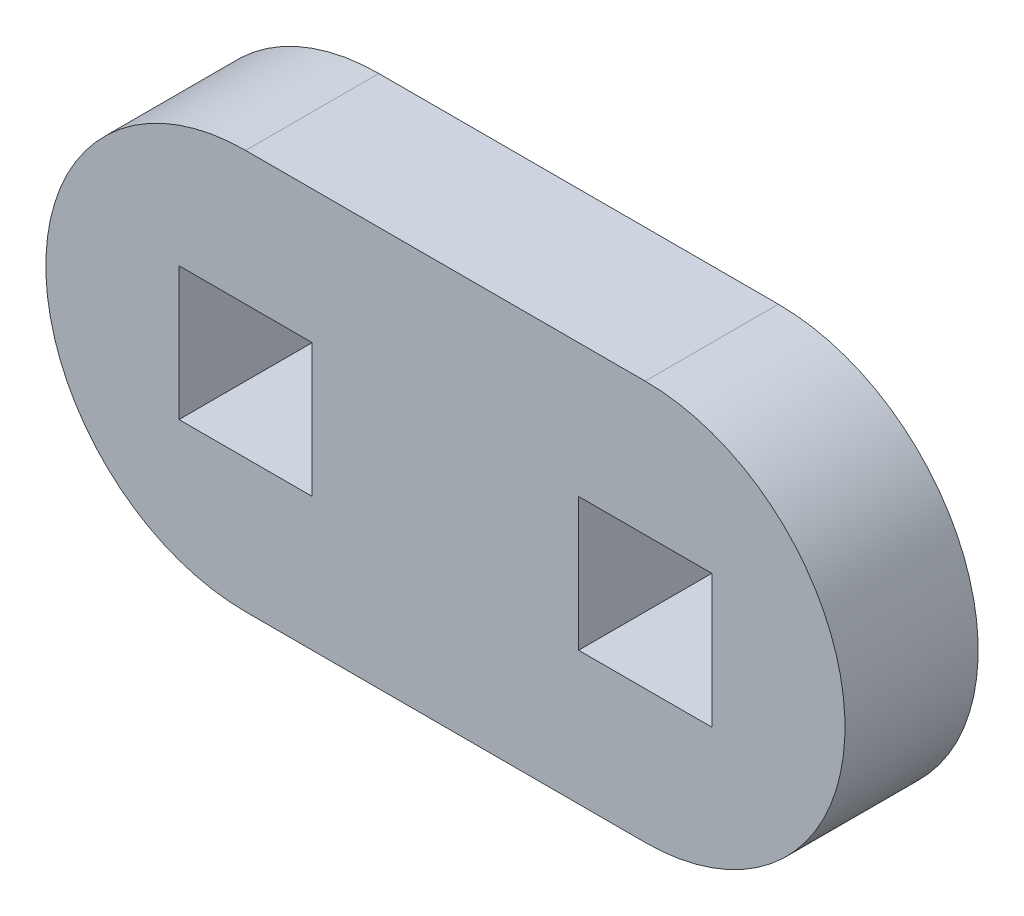
ISO-10303-21;
HEADER;
FILE_DESCRIPTION(('STEP AP214'),'2;1');
FILE_NAME('part.step','',(''),(''),'','','');
FILE_SCHEMA(('AUTOMOTIVE_DESIGN { 1 0 10303 214 1 1 1 1 }'));
ENDSEC;
DATA;
#1=APPLICATION_CONTEXT('core data for automotive mechanical design processes');
#2=APPLICATION_PROTOCOL_DEFINITION('international standard','automotive_design',2000,#1);
#3=PRODUCT_CONTEXT('',#1,'mechanical');
#4=PRODUCT('Part','Part','',(#3));
#5=PRODUCT_RELATED_PRODUCT_CATEGORY('part','',(#4));
#6=PRODUCT_DEFINITION_FORMATION('','',#4);
#7=PRODUCT_DEFINITION_CONTEXT('part definition',#1,'design');
#8=PRODUCT_DEFINITION('design','',#6,#7);
#9=PRODUCT_DEFINITION_SHAPE('','',#8);
#10=(LENGTH_UNIT() NAMED_UNIT(*) SI_UNIT(.MILLI.,.METRE.));
#11=(NAMED_UNIT(*) PLANE_ANGLE_UNIT() SI_UNIT($,.RADIAN.));
#12=(NAMED_UNIT(*) SI_UNIT($,.STERADIAN.) SOLID_ANGLE_UNIT());
#13=UNCERTAINTY_MEASURE_WITH_UNIT(LENGTH_MEASURE(1.E-05),#10,'distance_accuracy_value','');
#14=(GEOMETRIC_REPRESENTATION_CONTEXT(3) GLOBAL_UNCERTAINTY_ASSIGNED_CONTEXT((#13)) GLOBAL_UNIT_ASSIGNED_CONTEXT((#10,
#11,#12)) REPRESENTATION_CONTEXT('',''));
#15=CARTESIAN_POINT('',(0.,0.,0.));
#16=DIRECTION('',(0.,0.,1.));
#17=DIRECTION('',(1.,0.,0.));
#18=AXIS2_PLACEMENT_3D('',#15,#16,#17);
#19=CARTESIAN_POINT('',(12.6037950932,294.2834049743,3.));
#20=DIRECTION('',(0.,0.,1.));
#21=DIRECTION('',(1.,0.,0.));
#22=AXIS2_PLACEMENT_3D('',#19,#20,#21);
#23=PLANE('',#22);
#24=DIRECTION('',(0.,-1.,0.));
#25=VECTOR('',#24,1.);
#26=CARTESIAN_POINT('',(11.1037950932,295.7834049743,3.));
#27=LINE('',#26,#25);
#28=CARTESIAN_POINT('',(11.1037950932,295.7834049743,3.));
#29=VERTEX_POINT('',#28);
#30=CARTESIAN_POINT('',(11.1037950932,292.7834049743,3.));
#31=VERTEX_POINT('',#30);
#32=EDGE_CURVE('E160',#29,#31,#27,.T.);
#33=ORIENTED_EDGE('',*,*,#32,.F.);
#34=DIRECTION('',(-1.,0.,0.));
#35=VECTOR('',#34,1.);
#36=CARTESIAN_POINT('',(14.1037950932,295.7834049743,3.));
#37=LINE('',#36,#35);
#38=CARTESIAN_POINT('',(14.1037950932,295.7834049743,3.));
#39=VERTEX_POINT('',#38);
#40=EDGE_CURVE('E158',#39,#29,#37,.T.);
#41=ORIENTED_EDGE('',*,*,#40,.F.);
#42=DIRECTION('',(0.,1.,0.));
#43=VECTOR('',#42,1.);
#44=CARTESIAN_POINT('',(14.1037950932,292.7834049743,3.));
#45=LINE('',#44,#43);
#46=CARTESIAN_POINT('',(14.1037950932,292.7834049743,3.));
#47=VERTEX_POINT('',#46);
#48=EDGE_CURVE('E166',#47,#39,#45,.T.);
#49=ORIENTED_EDGE('',*,*,#48,.F.);
#50=DIRECTION('',(1.,0.,0.));
#51=VECTOR('',#50,1.);
#52=CARTESIAN_POINT('',(11.1037950932,292.7834049743,3.));
#53=LINE('',#52,#51);
#54=EDGE_CURVE('E163',#31,#47,#53,.T.);
#55=ORIENTED_EDGE('',*,*,#54,.F.);
#56=EDGE_LOOP('',(#33,#41,#49,#55));
#57=FACE_BOUND('',#56,.T.);
#58=CARTESIAN_POINT('',(12.6037950932,294.2834049743,3.));
#59=DIRECTION('',(0.,0.,1.));
#60=DIRECTION('',(1.,0.,0.));
#61=AXIS2_PLACEMENT_3D('',#58,#59,#60);
#62=CIRCLE('',#61,4.5);
#63=CARTESIAN_POINT('',(12.6037950932,298.7834049743,3.));
#64=VERTEX_POINT('',#63);
#65=CARTESIAN_POINT('',(12.6037950932,289.7834049743,3.));
#66=VERTEX_POINT('',#65);
#67=EDGE_CURVE('E189',#64,#66,#62,.T.);
#68=ORIENTED_EDGE('',*,*,#67,.T.);
#69=DIRECTION('',(1.,0.,0.));
#70=VECTOR('',#69,1.);
#71=CARTESIAN_POINT('',(12.6037950932,289.7834049743,3.));
#72=LINE('',#71,#70);
#73=CARTESIAN_POINT('',(21.6037950932,289.7834049743,3.));
#74=VERTEX_POINT('',#73);
#75=EDGE_CURVE('E192',#66,#74,#72,.T.);
#76=ORIENTED_EDGE('',*,*,#75,.T.);
#77=CARTESIAN_POINT('',(21.6037950932,294.2834049743,3.));
#78=DIRECTION('',(0.,0.,1.));
#79=DIRECTION('',(1.,0.,0.));
#80=AXIS2_PLACEMENT_3D('',#77,#78,#79);
#81=CIRCLE('',#80,4.5);
#82=CARTESIAN_POINT('',(21.6037950932,298.7834049743,3.));
#83=VERTEX_POINT('',#82);
#84=EDGE_CURVE('E195',#74,#83,#81,.T.);
#85=ORIENTED_EDGE('',*,*,#84,.T.);
#86=DIRECTION('',(-1.,0.,0.));
#87=VECTOR('',#86,1.);
#88=CARTESIAN_POINT('',(12.6037950932,298.7834049743,3.));
#89=LINE('',#88,#87);
#90=EDGE_CURVE('E197',#83,#64,#89,.T.);
#91=ORIENTED_EDGE('',*,*,#90,.T.);
#92=EDGE_LOOP('',(#68,#76,#85,#91));
#93=FACE_BOUND('',#92,.T.);
#94=DIRECTION('',(0.,-1.,0.));
#95=VECTOR('',#94,1.);
#96=CARTESIAN_POINT('',(20.1037950932,295.7834049743,3.));
#97=LINE('',#96,#95);
#98=CARTESIAN_POINT('',(20.1037950932,295.7834049743,3.));
#99=VERTEX_POINT('',#98);
#100=CARTESIAN_POINT('',(20.1037950932,292.7834049743,3.));
#101=VERTEX_POINT('',#100);
#102=EDGE_CURVE('E130',#99,#101,#97,.T.);
#103=ORIENTED_EDGE('',*,*,#102,.F.);
#104=DIRECTION('',(-1.,0.,0.));
#105=VECTOR('',#104,1.);
#106=CARTESIAN_POINT('',(23.1037950932,295.7834049743,3.));
#107=LINE('',#106,#105);
#108=CARTESIAN_POINT('',(23.1037950932,295.7834049743,3.));
#109=VERTEX_POINT('',#108);
#110=EDGE_CURVE('E122',#109,#99,#107,.T.);
#111=ORIENTED_EDGE('',*,*,#110,.F.);
#112=DIRECTION('',(0.,1.,0.));
#113=VECTOR('',#112,1.);
#114=CARTESIAN_POINT('',(23.1037950932,292.7834049743,3.));
#115=LINE('',#114,#113);
#116=CARTESIAN_POINT('',(23.1037950932,292.7834049743,3.));
#117=VERTEX_POINT('',#116);
#118=EDGE_CURVE('E144',#117,#109,#115,.T.);
#119=ORIENTED_EDGE('',*,*,#118,.F.);
#120=DIRECTION('',(1.,0.,0.));
#121=VECTOR('',#120,1.);
#122=CARTESIAN_POINT('',(20.1037950932,292.7834049743,3.));
#123=LINE('',#122,#121);
#124=EDGE_CURVE('E142',#101,#117,#123,.T.);
#125=ORIENTED_EDGE('',*,*,#124,.F.);
#126=EDGE_LOOP('',(#103,#111,#119,#125));
#127=FACE_BOUND('',#126,.T.);
#128=ADVANCED_FACE('F33',(#57,#93,#127),#23,.T.);
#129=CARTESIAN_POINT('',(12.6037950932,294.2834049743,0.));
#130=DIRECTION('',(0.,0.,1.));
#131=DIRECTION('',(1.,0.,0.));
#132=AXIS2_PLACEMENT_3D('',#129,#130,#131);
#133=PLANE('',#132);
#134=DIRECTION('',(-1.,0.,0.));
#135=VECTOR('',#134,1.);
#136=CARTESIAN_POINT('',(14.1037950932,295.7834049743,0.));
#137=LINE('',#136,#135);
#138=CARTESIAN_POINT('',(14.1037950932,295.7834049743,0.));
#139=VERTEX_POINT('',#138);
#140=CARTESIAN_POINT('',(11.1037950932,295.7834049743,0.));
#141=VERTEX_POINT('',#140);
#142=EDGE_CURVE('E138',#139,#141,#137,.T.);
#143=ORIENTED_EDGE('',*,*,#142,.T.);
#144=DIRECTION('',(0.,-1.,0.));
#145=VECTOR('',#144,1.);
#146=CARTESIAN_POINT('',(11.1037950932,295.7834049743,0.));
#147=LINE('',#146,#145);
#148=CARTESIAN_POINT('',(11.1037950932,292.7834049743,0.));
#149=VERTEX_POINT('',#148);
#150=EDGE_CURVE('E171',#141,#149,#147,.T.);
#151=ORIENTED_EDGE('',*,*,#150,.T.);
#152=DIRECTION('',(1.,0.,0.));
#153=VECTOR('',#152,1.);
#154=CARTESIAN_POINT('',(11.1037950932,292.7834049743,0.));
#155=LINE('',#154,#153);
#156=CARTESIAN_POINT('',(14.1037950932,292.7834049743,0.));
#157=VERTEX_POINT('',#156);
#158=EDGE_CURVE('E174',#149,#157,#155,.T.);
#159=ORIENTED_EDGE('',*,*,#158,.T.);
#160=DIRECTION('',(0.,1.,0.));
#161=VECTOR('',#160,1.);
#162=CARTESIAN_POINT('',(14.1037950932,292.7834049743,0.));
#163=LINE('',#162,#161);
#164=EDGE_CURVE('E161',#157,#139,#163,.T.);
#165=ORIENTED_EDGE('',*,*,#164,.T.);
#166=EDGE_LOOP('',(#143,#151,#159,#165));
#167=FACE_BOUND('',#166,.T.);
#168=CARTESIAN_POINT('',(12.6037950932,294.2834049743,0.));
#169=DIRECTION('',(0.,0.,1.));
#170=DIRECTION('',(1.,0.,0.));
#171=AXIS2_PLACEMENT_3D('',#168,#169,#170);
#172=CIRCLE('',#171,4.5);
#173=CARTESIAN_POINT('',(12.6037950932,298.7834049743,0.));
#174=VERTEX_POINT('',#173);
#175=CARTESIAN_POINT('',(12.6037950932,289.7834049743,0.));
#176=VERTEX_POINT('',#175);
#177=EDGE_CURVE('E188',#174,#176,#172,.T.);
#178=ORIENTED_EDGE('',*,*,#177,.F.);
#179=DIRECTION('',(-1.,0.,0.));
#180=VECTOR('',#179,1.);
#181=CARTESIAN_POINT('',(12.6037950932,298.7834049743,0.));
#182=LINE('',#181,#180);
#183=CARTESIAN_POINT('',(21.6037950932,298.7834049743,0.));
#184=VERTEX_POINT('',#183);
#185=EDGE_CURVE('E193',#184,#174,#182,.T.);
#186=ORIENTED_EDGE('',*,*,#185,.F.);
#187=CARTESIAN_POINT('',(21.6037950932,294.2834049743,0.));
#188=DIRECTION('',(0.,0.,1.));
#189=DIRECTION('',(1.,0.,0.));
#190=AXIS2_PLACEMENT_3D('',#187,#188,#189);
#191=CIRCLE('',#190,4.5);
#192=CARTESIAN_POINT('',(21.6037950932,289.7834049743,0.));
#193=VERTEX_POINT('',#192);
#194=EDGE_CURVE('E204',#193,#184,#191,.T.);
#195=ORIENTED_EDGE('',*,*,#194,.F.);
#196=DIRECTION('',(1.,0.,0.));
#197=VECTOR('',#196,1.);
#198=CARTESIAN_POINT('',(12.6037950932,289.7834049743,0.));
#199=LINE('',#198,#197);
#200=EDGE_CURVE('E202',#176,#193,#199,.T.);
#201=ORIENTED_EDGE('',*,*,#200,.F.);
#202=EDGE_LOOP('',(#178,#186,#195,#201));
#203=FACE_BOUND('',#202,.T.);
#204=DIRECTION('',(-1.,0.,0.));
#205=VECTOR('',#204,1.);
#206=CARTESIAN_POINT('',(23.1037950932,295.7834049743,0.));
#207=LINE('',#206,#205);
#208=CARTESIAN_POINT('',(23.1037950932,295.7834049743,0.));
#209=VERTEX_POINT('',#208);
#210=CARTESIAN_POINT('',(20.1037950932,295.7834049743,0.));
#211=VERTEX_POINT('',#210);
#212=EDGE_CURVE('E56',#209,#211,#207,.T.);
#213=ORIENTED_EDGE('',*,*,#212,.T.);
#214=DIRECTION('',(0.,-1.,0.));
#215=VECTOR('',#214,1.);
#216=CARTESIAN_POINT('',(20.1037950932,295.7834049743,0.));
#217=LINE('',#216,#215);
#218=CARTESIAN_POINT('',(20.1037950932,292.7834049743,0.));
#219=VERTEX_POINT('',#218);
#220=EDGE_CURVE('E137',#211,#219,#217,.T.);
#221=ORIENTED_EDGE('',*,*,#220,.T.);
#222=DIRECTION('',(1.,0.,0.));
#223=VECTOR('',#222,1.);
#224=CARTESIAN_POINT('',(20.1037950932,292.7834049743,0.));
#225=LINE('',#224,#223);
#226=CARTESIAN_POINT('',(23.1037950932,292.7834049743,0.));
#227=VERTEX_POINT('',#226);
#228=EDGE_CURVE('E150',#219,#227,#225,.T.);
#229=ORIENTED_EDGE('',*,*,#228,.T.);
#230=DIRECTION('',(0.,1.,0.));
#231=VECTOR('',#230,1.);
#232=CARTESIAN_POINT('',(23.1037950932,292.7834049743,0.));
#233=LINE('',#232,#231);
#234=EDGE_CURVE('E131',#227,#209,#233,.T.);
#235=ORIENTED_EDGE('',*,*,#234,.T.);
#236=EDGE_LOOP('',(#213,#221,#229,#235));
#237=FACE_BOUND('',#236,.T.);
#238=ADVANCED_FACE('F222',(#167,#203,#237),#133,.F.);
#239=CARTESIAN_POINT('',(12.6037950932,294.2834049743,3.));
#240=DIRECTION('',(0.,0.,-1.));
#241=DIRECTION('',(-1.,0.,0.));
#242=AXIS2_PLACEMENT_3D('',#239,#240,#241);
#243=CYLINDRICAL_SURFACE('',#242,4.5);
#244=ORIENTED_EDGE('',*,*,#177,.T.);
#245=DIRECTION('',(0.,0.,-1.));
#246=VECTOR('',#245,1.);
#247=CARTESIAN_POINT('',(12.6037950932,289.7834049743,3.));
#248=LINE('',#247,#246);
#249=EDGE_CURVE('E11',#66,#176,#248,.T.);
#250=ORIENTED_EDGE('',*,*,#249,.F.);
#251=ORIENTED_EDGE('',*,*,#67,.F.);
#252=DIRECTION('',(0.,0.,-1.));
#253=VECTOR('',#252,1.);
#254=CARTESIAN_POINT('',(12.6037950932,298.7834049743,3.));
#255=LINE('',#254,#253);
#256=EDGE_CURVE('E199',#64,#174,#255,.T.);
#257=ORIENTED_EDGE('',*,*,#256,.T.);
#258=EDGE_LOOP('',(#244,#250,#251,#257));
#259=FACE_BOUND('',#258,.T.);
#260=ADVANCED_FACE('F35',(#259),#243,.T.);
#261=CARTESIAN_POINT('',(12.6037950932,289.7834049743,3.));
#262=DIRECTION('',(0.,1.,0.));
#263=DIRECTION('',(0.,0.,1.));
#264=AXIS2_PLACEMENT_3D('',#261,#262,#263);
#265=PLANE('',#264);
#266=ORIENTED_EDGE('',*,*,#200,.T.);
#267=DIRECTION('',(0.,0.,-1.));
#268=VECTOR('',#267,1.);
#269=CARTESIAN_POINT('',(21.6037950932,289.7834049743,3.));
#270=LINE('',#269,#268);
#271=EDGE_CURVE('E41',#74,#193,#270,.T.);
#272=ORIENTED_EDGE('',*,*,#271,.F.);
#273=ORIENTED_EDGE('',*,*,#75,.F.);
#274=ORIENTED_EDGE('',*,*,#249,.T.);
#275=EDGE_LOOP('',(#266,#272,#273,#274));
#276=FACE_BOUND('',#275,.T.);
#277=ADVANCED_FACE('F232',(#276),#265,.F.);
#278=CARTESIAN_POINT('',(21.6037950932,294.2834049743,3.));
#279=DIRECTION('',(0.,0.,-1.));
#280=DIRECTION('',(-1.,0.,0.));
#281=AXIS2_PLACEMENT_3D('',#278,#279,#280);
#282=CYLINDRICAL_SURFACE('',#281,4.5);
#283=ORIENTED_EDGE('',*,*,#194,.T.);
#284=DIRECTION('',(0.,0.,-1.));
#285=VECTOR('',#284,1.);
#286=CARTESIAN_POINT('',(21.6037950932,298.7834049743,3.));
#287=LINE('',#286,#285);
#288=EDGE_CURVE('E209',#83,#184,#287,.T.);
#289=ORIENTED_EDGE('',*,*,#288,.F.);
#290=ORIENTED_EDGE('',*,*,#84,.F.);
#291=ORIENTED_EDGE('',*,*,#271,.T.);
#292=EDGE_LOOP('',(#283,#289,#290,#291));
#293=FACE_BOUND('',#292,.T.);
#294=ADVANCED_FACE('F216',(#293),#282,.T.);
#295=CARTESIAN_POINT('',(12.6037950932,298.7834049743,3.));
#296=DIRECTION('',(0.,-1.,0.));
#297=DIRECTION('',(0.,0.,-1.));
#298=AXIS2_PLACEMENT_3D('',#295,#296,#297);
#299=PLANE('',#298);
#300=ORIENTED_EDGE('',*,*,#185,.T.);
#301=ORIENTED_EDGE('',*,*,#256,.F.);
#302=ORIENTED_EDGE('',*,*,#90,.F.);
#303=ORIENTED_EDGE('',*,*,#288,.T.);
#304=EDGE_LOOP('',(#300,#301,#302,#303));
#305=FACE_BOUND('',#304,.T.);
#306=ADVANCED_FACE('F226',(#305),#299,.F.);
#307=CARTESIAN_POINT('',(14.1037950932,295.7834049743,3.));
#308=DIRECTION('',(0.,-1.,0.));
#309=DIRECTION('',(0.,0.,-1.));
#310=AXIS2_PLACEMENT_3D('',#307,#308,#309);
#311=PLANE('',#310);
#312=ORIENTED_EDGE('',*,*,#142,.F.);
#313=DIRECTION('',(0.,0.,-1.));
#314=VECTOR('',#313,1.);
#315=CARTESIAN_POINT('',(14.1037950932,295.7834049743,3.));
#316=LINE('',#315,#314);
#317=EDGE_CURVE('E168',#39,#139,#316,.T.);
#318=ORIENTED_EDGE('',*,*,#317,.F.);
#319=ORIENTED_EDGE('',*,*,#40,.T.);
#320=DIRECTION('',(0.,0.,-1.));
#321=VECTOR('',#320,1.);
#322=CARTESIAN_POINT('',(11.1037950932,295.7834049743,3.));
#323=LINE('',#322,#321);
#324=EDGE_CURVE('E185',#29,#141,#323,.T.);
#325=ORIENTED_EDGE('',*,*,#324,.T.);
#326=EDGE_LOOP('',(#312,#318,#319,#325));
#327=FACE_BOUND('',#326,.T.);
#328=ADVANCED_FACE('F249',(#327),#311,.T.);
#329=CARTESIAN_POINT('',(11.1037950932,295.7834049743,3.));
#330=DIRECTION('',(1.,0.,0.));
#331=DIRECTION('',(0.,0.,-1.));
#332=AXIS2_PLACEMENT_3D('',#329,#330,#331);
#333=PLANE('',#332);
#334=ORIENTED_EDGE('',*,*,#150,.F.);
#335=ORIENTED_EDGE('',*,*,#324,.F.);
#336=ORIENTED_EDGE('',*,*,#32,.T.);
#337=DIRECTION('',(0.,0.,-1.));
#338=VECTOR('',#337,1.);
#339=CARTESIAN_POINT('',(11.1037950932,292.7834049743,3.));
#340=LINE('',#339,#338);
#341=EDGE_CURVE('E183',#31,#149,#340,.T.);
#342=ORIENTED_EDGE('',*,*,#341,.T.);
#343=EDGE_LOOP('',(#334,#335,#336,#342));
#344=FACE_BOUND('',#343,.T.);
#345=ADVANCED_FACE('F256',(#344),#333,.T.);
#346=CARTESIAN_POINT('',(11.1037950932,292.7834049743,3.));
#347=DIRECTION('',(0.,1.,0.));
#348=DIRECTION('',(0.,0.,1.));
#349=AXIS2_PLACEMENT_3D('',#346,#347,#348);
#350=PLANE('',#349);
#351=ORIENTED_EDGE('',*,*,#158,.F.);
#352=ORIENTED_EDGE('',*,*,#341,.F.);
#353=ORIENTED_EDGE('',*,*,#54,.T.);
#354=DIRECTION('',(0.,0.,-1.));
#355=VECTOR('',#354,1.);
#356=CARTESIAN_POINT('',(14.1037950932,292.7834049743,3.));
#357=LINE('',#356,#355);
#358=EDGE_CURVE('E181',#47,#157,#357,.T.);
#359=ORIENTED_EDGE('',*,*,#358,.T.);
#360=EDGE_LOOP('',(#351,#352,#353,#359));
#361=FACE_BOUND('',#360,.T.);
#362=ADVANCED_FACE('F261',(#361),#350,.T.);
#363=CARTESIAN_POINT('',(14.1037950932,292.7834049743,3.));
#364=DIRECTION('',(-1.,0.,0.));
#365=DIRECTION('',(0.,0.,1.));
#366=AXIS2_PLACEMENT_3D('',#363,#364,#365);
#367=PLANE('',#366);
#368=ORIENTED_EDGE('',*,*,#164,.F.);
#369=ORIENTED_EDGE('',*,*,#358,.F.);
#370=ORIENTED_EDGE('',*,*,#48,.T.);
#371=ORIENTED_EDGE('',*,*,#317,.T.);
#372=EDGE_LOOP('',(#368,#369,#370,#371));
#373=FACE_BOUND('',#372,.T.);
#374=ADVANCED_FACE('F268',(#373),#367,.T.);
#375=CARTESIAN_POINT('',(23.1037950932,295.7834049743,3.));
#376=DIRECTION('',(0.,-1.,0.));
#377=DIRECTION('',(0.,0.,-1.));
#378=AXIS2_PLACEMENT_3D('',#375,#376,#377);
#379=PLANE('',#378);
#380=ORIENTED_EDGE('',*,*,#212,.F.);
#381=DIRECTION('',(0.,0.,-1.));
#382=VECTOR('',#381,1.);
#383=CARTESIAN_POINT('',(23.1037950932,295.7834049743,3.));
#384=LINE('',#383,#382);
#385=EDGE_CURVE('E126',#109,#209,#384,.T.);
#386=ORIENTED_EDGE('',*,*,#385,.F.);
#387=ORIENTED_EDGE('',*,*,#110,.T.);
#388=DIRECTION('',(0.,0.,-1.));
#389=VECTOR('',#388,1.);
#390=CARTESIAN_POINT('',(20.1037950932,295.7834049743,3.));
#391=LINE('',#390,#389);
#392=EDGE_CURVE('E125',#99,#211,#391,.T.);
#393=ORIENTED_EDGE('',*,*,#392,.T.);
#394=EDGE_LOOP('',(#380,#386,#387,#393));
#395=FACE_BOUND('',#394,.T.);
#396=ADVANCED_FACE('F124',(#395),#379,.T.);
#397=CARTESIAN_POINT('',(20.1037950932,295.7834049743,3.));
#398=DIRECTION('',(1.,0.,0.));
#399=DIRECTION('',(0.,0.,-1.));
#400=AXIS2_PLACEMENT_3D('',#397,#398,#399);
#401=PLANE('',#400);
#402=ORIENTED_EDGE('',*,*,#220,.F.);
#403=ORIENTED_EDGE('',*,*,#392,.F.);
#404=ORIENTED_EDGE('',*,*,#102,.T.);
#405=DIRECTION('',(0.,0.,-1.));
#406=VECTOR('',#405,1.);
#407=CARTESIAN_POINT('',(20.1037950932,292.7834049743,3.));
#408=LINE('',#407,#406);
#409=EDGE_CURVE('E139',#101,#219,#408,.T.);
#410=ORIENTED_EDGE('',*,*,#409,.T.);
#411=EDGE_LOOP('',(#402,#403,#404,#410));
#412=FACE_BOUND('',#411,.T.);
#413=ADVANCED_FACE('F134',(#412),#401,.T.);
#414=CARTESIAN_POINT('',(20.1037950932,292.7834049743,3.));
#415=DIRECTION('',(0.,1.,0.));
#416=DIRECTION('',(0.,0.,1.));
#417=AXIS2_PLACEMENT_3D('',#414,#415,#416);
#418=PLANE('',#417);
#419=ORIENTED_EDGE('',*,*,#228,.F.);
#420=ORIENTED_EDGE('',*,*,#409,.F.);
#421=ORIENTED_EDGE('',*,*,#124,.T.);
#422=DIRECTION('',(0.,0.,-1.));
#423=VECTOR('',#422,1.);
#424=CARTESIAN_POINT('',(23.1037950932,292.7834049743,3.));
#425=LINE('',#424,#423);
#426=EDGE_CURVE('E48',#117,#227,#425,.T.);
#427=ORIENTED_EDGE('',*,*,#426,.T.);
#428=EDGE_LOOP('',(#419,#420,#421,#427));
#429=FACE_BOUND('',#428,.T.);
#430=ADVANCED_FACE('F285',(#429),#418,.T.);
#431=CARTESIAN_POINT('',(23.1037950932,292.7834049743,3.));
#432=DIRECTION('',(-1.,0.,0.));
#433=DIRECTION('',(0.,0.,1.));
#434=AXIS2_PLACEMENT_3D('',#431,#432,#433);
#435=PLANE('',#434);
#436=ORIENTED_EDGE('',*,*,#234,.F.);
#437=ORIENTED_EDGE('',*,*,#426,.F.);
#438=ORIENTED_EDGE('',*,*,#118,.T.);
#439=ORIENTED_EDGE('',*,*,#385,.T.);
#440=EDGE_LOOP('',(#436,#437,#438,#439));
#441=FACE_BOUND('',#440,.T.);
#442=ADVANCED_FACE('F288',(#441),#435,.T.);
#443=CLOSED_SHELL('',(#128,#238,#260,#277,#294,#306,#328,#345,#362,#374,#396,#413,#430,#442));
#444=MANIFOLD_SOLID_BREP('B2',#443);
#445=ADVANCED_BREP_SHAPE_REPRESENTATION('',(#18,#444),#14);
#446=SHAPE_DEFINITION_REPRESENTATION(#9,#445);
ENDSEC;
END-ISO-10303-21;
